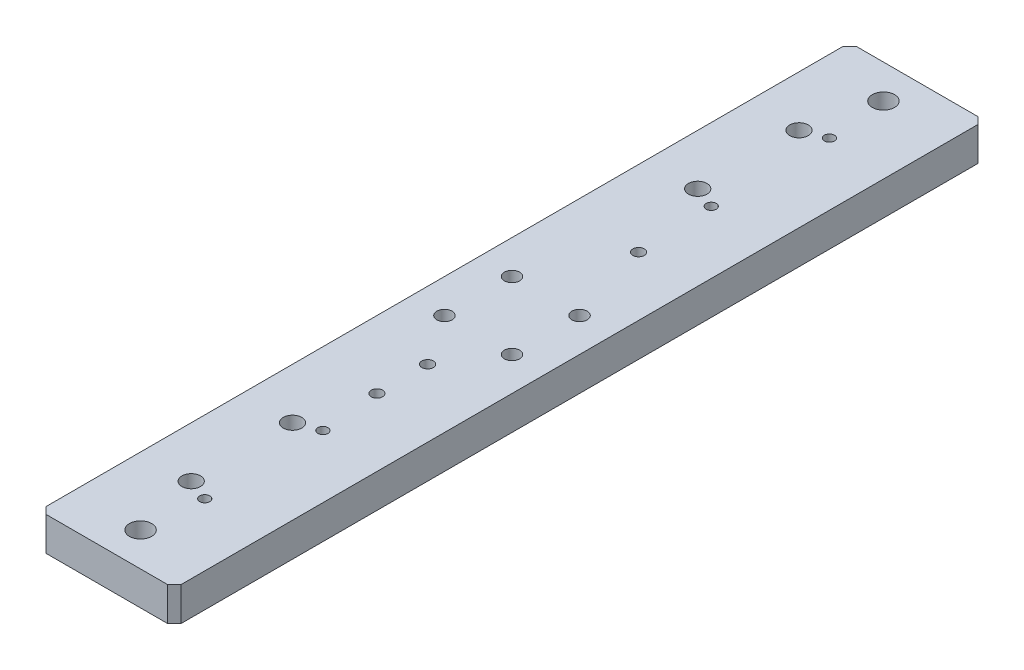
ISO-10303-21;
HEADER;
FILE_DESCRIPTION(('STEP AP214'),'2;1');
FILE_NAME('part.step','',(''),(''),'','','');
FILE_SCHEMA(('AUTOMOTIVE_DESIGN { 1 0 10303 214 1 1 1 1 }'));
ENDSEC;
DATA;
#1=APPLICATION_CONTEXT('core data for automotive mechanical design processes');
#2=APPLICATION_PROTOCOL_DEFINITION('international standard','automotive_design',2000,#1);
#3=PRODUCT_CONTEXT('',#1,'mechanical');
#4=PRODUCT('Part','Part','',(#3));
#5=PRODUCT_RELATED_PRODUCT_CATEGORY('part','',(#4));
#6=PRODUCT_DEFINITION_FORMATION('','',#4);
#7=PRODUCT_DEFINITION_CONTEXT('part definition',#1,'design');
#8=PRODUCT_DEFINITION('design','',#6,#7);
#9=PRODUCT_DEFINITION_SHAPE('','',#8);
#10=(LENGTH_UNIT() NAMED_UNIT(*) SI_UNIT(.MILLI.,.METRE.));
#11=(NAMED_UNIT(*) PLANE_ANGLE_UNIT() SI_UNIT($,.RADIAN.));
#12=(NAMED_UNIT(*) SI_UNIT($,.STERADIAN.) SOLID_ANGLE_UNIT());
#13=UNCERTAINTY_MEASURE_WITH_UNIT(LENGTH_MEASURE(1.E-05),#10,'distance_accuracy_value','');
#14=(GEOMETRIC_REPRESENTATION_CONTEXT(3) GLOBAL_UNCERTAINTY_ASSIGNED_CONTEXT((#13)) GLOBAL_UNIT_ASSIGNED_CONTEXT((#10,
#11,#12)) REPRESENTATION_CONTEXT('',''));
#15=CARTESIAN_POINT('',(0.,0.,0.));
#16=DIRECTION('',(0.,0.,1.));
#17=DIRECTION('',(1.,0.,0.));
#18=AXIS2_PLACEMENT_3D('',#15,#16,#17);
#19=CARTESIAN_POINT('',(0.,10.,120.));
#20=DIRECTION('',(0.,-1.,0.));
#21=DIRECTION('',(0.,0.,-1.));
#22=AXIS2_PLACEMENT_3D('',#19,#20,#21);
#23=PLANE('',#22);
#24=CARTESIAN_POINT('',(22.5,10.,-35.));
#25=DIRECTION('',(0.,-1.,0.));
#26=DIRECTION('',(0.,0.,-1.));
#27=AXIS2_PLACEMENT_3D('',#24,#25,#26);
#28=CIRCLE('',#27,1.7);
#29=CARTESIAN_POINT('',(22.5,10.,-36.7));
#30=VERTEX_POINT('',#29);
#31=EDGE_CURVE('E124',#30,#30,#28,.T.);
#32=ORIENTED_EDGE('',*,*,#31,.T.);
#33=EDGE_LOOP('',(#32));
#34=FACE_BOUND('',#33,.T.);
#35=CARTESIAN_POINT('',(30.,10.,-10.));
#36=DIRECTION('',(0.,1.,0.));
#37=DIRECTION('',(0.,0.,1.));
#38=AXIS2_PLACEMENT_3D('',#35,#36,#37);
#39=CIRCLE('',#38,2.25);
#40=CARTESIAN_POINT('',(30.,10.,-7.75));
#41=VERTEX_POINT('',#40);
#42=EDGE_CURVE('E127',#41,#41,#39,.T.);
#43=ORIENTED_EDGE('',*,*,#42,.F.);
#44=EDGE_LOOP('',(#43));
#45=FACE_BOUND('',#44,.T.);
#46=CARTESIAN_POINT('',(10.,10.,-10.));
#47=DIRECTION('',(0.,1.,0.));
#48=DIRECTION('',(0.,0.,1.));
#49=AXIS2_PLACEMENT_3D('',#46,#47,#48);
#50=CIRCLE('',#49,2.25);
#51=CARTESIAN_POINT('',(10.,10.,-7.75));
#52=VERTEX_POINT('',#51);
#53=EDGE_CURVE('E139',#52,#52,#50,.T.);
#54=ORIENTED_EDGE('',*,*,#53,.F.);
#55=EDGE_LOOP('',(#54));
#56=FACE_BOUND('',#55,.T.);
#57=CARTESIAN_POINT('',(30.,10.,10.));
#58=DIRECTION('',(0.,1.,0.));
#59=DIRECTION('',(0.,0.,1.));
#60=AXIS2_PLACEMENT_3D('',#57,#58,#59);
#61=CIRCLE('',#60,2.25);
#62=CARTESIAN_POINT('',(30.,10.,12.25));
#63=VERTEX_POINT('',#62);
#64=EDGE_CURVE('E145',#63,#63,#61,.T.);
#65=ORIENTED_EDGE('',*,*,#64,.F.);
#66=EDGE_LOOP('',(#65));
#67=FACE_BOUND('',#66,.T.);
#68=CARTESIAN_POINT('',(20.,10.,40.));
#69=DIRECTION('',(0.,1.,0.));
#70=DIRECTION('',(0.,0.,1.));
#71=AXIS2_PLACEMENT_3D('',#68,#69,#70);
#72=CIRCLE('',#71,1.7);
#73=CARTESIAN_POINT('',(20.,10.,41.7));
#74=VERTEX_POINT('',#73);
#75=EDGE_CURVE('E151',#74,#74,#72,.T.);
#76=ORIENTED_EDGE('',*,*,#75,.F.);
#77=EDGE_LOOP('',(#76));
#78=FACE_BOUND('',#77,.T.);
#79=CARTESIAN_POINT('',(20.,10.,25.));
#80=DIRECTION('',(0.,1.,0.));
#81=DIRECTION('',(0.,0.,1.));
#82=AXIS2_PLACEMENT_3D('',#79,#80,#81);
#83=CIRCLE('',#82,1.7);
#84=CARTESIAN_POINT('',(20.,10.,26.7));
#85=VERTEX_POINT('',#84);
#86=EDGE_CURVE('E157',#85,#85,#83,.T.);
#87=ORIENTED_EDGE('',*,*,#86,.F.);
#88=EDGE_LOOP('',(#87));
#89=FACE_BOUND('',#88,.T.);
#90=CARTESIAN_POINT('',(21.5,10.,92.5));
#91=DIRECTION('',(0.,1.,0.));
#92=DIRECTION('',(0.,0.,1.));
#93=AXIS2_PLACEMENT_3D('',#90,#91,#92);
#94=CIRCLE('',#93,1.5);
#95=CARTESIAN_POINT('',(21.5,10.,94.));
#96=VERTEX_POINT('',#95);
#97=EDGE_CURVE('E163',#96,#96,#94,.T.);
#98=ORIENTED_EDGE('',*,*,#97,.F.);
#99=EDGE_LOOP('',(#98));
#100=FACE_BOUND('',#99,.T.);
#101=CARTESIAN_POINT('',(21.5,10.,57.5));
#102=DIRECTION('',(0.,1.,0.));
#103=DIRECTION('',(0.,0.,1.));
#104=AXIS2_PLACEMENT_3D('',#101,#102,#103);
#105=CIRCLE('',#104,1.49999999999999);
#106=CARTESIAN_POINT('',(21.5,10.,59.));
#107=VERTEX_POINT('',#106);
#108=EDGE_CURVE('E169',#107,#107,#105,.T.);
#109=ORIENTED_EDGE('',*,*,#108,.F.);
#110=EDGE_LOOP('',(#109));
#111=FACE_BOUND('',#110,.T.);
#112=CARTESIAN_POINT('',(20.,10.,110.));
#113=DIRECTION('',(0.,-1.,0.));
#114=DIRECTION('',(0.,0.,-1.));
#115=AXIS2_PLACEMENT_3D('',#112,#113,#114);
#116=CIRCLE('',#115,3.3);
#117=CARTESIAN_POINT('',(20.,10.,106.7));
#118=VERTEX_POINT('',#117);
#119=EDGE_CURVE('E178',#118,#118,#116,.T.);
#120=ORIENTED_EDGE('',*,*,#119,.T.);
#121=EDGE_LOOP('',(#120));
#122=FACE_BOUND('',#121,.T.);
#123=CARTESIAN_POINT('',(15.,10.,60.));
#124=DIRECTION('',(0.,1.,0.));
#125=DIRECTION('',(0.,0.,1.));
#126=AXIS2_PLACEMENT_3D('',#123,#124,#125);
#127=CIRCLE('',#126,2.75);
#128=CARTESIAN_POINT('',(15.,10.,62.75));
#129=VERTEX_POINT('',#128);
#130=EDGE_CURVE('E187',#129,#129,#127,.T.);
#131=ORIENTED_EDGE('',*,*,#130,.F.);
#132=EDGE_LOOP('',(#131));
#133=FACE_BOUND('',#132,.T.);
#134=CARTESIAN_POINT('',(21.5,10.,-92.5));
#135=DIRECTION('',(0.,1.,0.));
#136=DIRECTION('',(0.,0.,1.));
#137=AXIS2_PLACEMENT_3D('',#134,#135,#136);
#138=CIRCLE('',#137,1.5);
#139=CARTESIAN_POINT('',(21.5,10.,-91.));
#140=VERTEX_POINT('',#139);
#141=EDGE_CURVE('E193',#140,#140,#138,.T.);
#142=ORIENTED_EDGE('',*,*,#141,.F.);
#143=EDGE_LOOP('',(#142));
#144=FACE_BOUND('',#143,.T.);
#145=CARTESIAN_POINT('',(21.5,10.,-57.5));
#146=DIRECTION('',(0.,1.,0.));
#147=DIRECTION('',(0.,0.,1.));
#148=AXIS2_PLACEMENT_3D('',#145,#146,#147);
#149=CIRCLE('',#148,1.49999999999999);
#150=CARTESIAN_POINT('',(21.5,10.,-56.));
#151=VERTEX_POINT('',#150);
#152=EDGE_CURVE('E199',#151,#151,#149,.T.);
#153=ORIENTED_EDGE('',*,*,#152,.F.);
#154=EDGE_LOOP('',(#153));
#155=FACE_BOUND('',#154,.T.);
#156=CARTESIAN_POINT('',(20.,10.,-110.));
#157=DIRECTION('',(0.,-1.,0.));
#158=DIRECTION('',(0.,0.,-1.));
#159=AXIS2_PLACEMENT_3D('',#156,#157,#158);
#160=CIRCLE('',#159,3.3);
#161=CARTESIAN_POINT('',(20.,10.,-113.3));
#162=VERTEX_POINT('',#161);
#163=EDGE_CURVE('E208',#162,#162,#160,.T.);
#164=ORIENTED_EDGE('',*,*,#163,.T.);
#165=EDGE_LOOP('',(#164));
#166=FACE_BOUND('',#165,.T.);
#167=CARTESIAN_POINT('',(15.,10.,-90.));
#168=DIRECTION('',(0.,1.,0.));
#169=DIRECTION('',(0.,0.,1.));
#170=AXIS2_PLACEMENT_3D('',#167,#168,#169);
#171=CIRCLE('',#170,2.75);
#172=CARTESIAN_POINT('',(15.,10.,-87.25));
#173=VERTEX_POINT('',#172);
#174=EDGE_CURVE('E211',#173,#173,#171,.T.);
#175=ORIENTED_EDGE('',*,*,#174,.F.);
#176=EDGE_LOOP('',(#175));
#177=FACE_BOUND('',#176,.T.);
#178=DIRECTION('',(0.,0.,-1.));
#179=VECTOR('',#178,1.);
#180=CARTESIAN_POINT('',(40.,10.,120.));
#181=LINE('',#180,#179);
#182=CARTESIAN_POINT('',(40.,10.,118.));
#183=VERTEX_POINT('',#182);
#184=CARTESIAN_POINT('',(40.,10.,-118.));
#185=VERTEX_POINT('',#184);
#186=EDGE_CURVE('E238',#183,#185,#181,.T.);
#187=ORIENTED_EDGE('',*,*,#186,.T.);
#188=DIRECTION('',(-0.707106781186553,0.,-0.707106781186543));
#189=VECTOR('',#188,1.);
#190=CARTESIAN_POINT('',(40.,10.,-118.));
#191=LINE('',#190,#189);
#192=CARTESIAN_POINT('',(38.,10.,-120.));
#193=VERTEX_POINT('',#192);
#194=EDGE_CURVE('E257',#185,#193,#191,.T.);
#195=ORIENTED_EDGE('',*,*,#194,.T.);
#196=DIRECTION('',(-1.,0.,0.));
#197=VECTOR('',#196,1.);
#198=CARTESIAN_POINT('',(0.,10.,-120.));
#199=LINE('',#198,#197);
#200=CARTESIAN_POINT('',(2.00000000000006,10.,-120.));
#201=VERTEX_POINT('',#200);
#202=EDGE_CURVE('E228',#193,#201,#199,.T.);
#203=ORIENTED_EDGE('',*,*,#202,.T.);
#204=DIRECTION('',(-0.707106781186553,0.,0.707106781186543));
#205=VECTOR('',#204,1.);
#206=CARTESIAN_POINT('',(0.,10.,-118.));
#207=LINE('',#206,#205);
#208=CARTESIAN_POINT('',(0.,10.,-118.));
#209=VERTEX_POINT('',#208);
#210=EDGE_CURVE('E251',#201,#209,#207,.T.);
#211=ORIENTED_EDGE('',*,*,#210,.T.);
#212=DIRECTION('',(0.,0.,-1.));
#213=VECTOR('',#212,1.);
#214=CARTESIAN_POINT('',(0.,10.,120.));
#215=LINE('',#214,#213);
#216=CARTESIAN_POINT('',(0.,10.,118.));
#217=VERTEX_POINT('',#216);
#218=EDGE_CURVE('E231',#217,#209,#215,.T.);
#219=ORIENTED_EDGE('',*,*,#218,.F.);
#220=DIRECTION('',(-0.707106781186543,0.,-0.707106781186553));
#221=VECTOR('',#220,1.);
#222=CARTESIAN_POINT('',(1.99999999999997,10.,120.));
#223=LINE('',#222,#221);
#224=CARTESIAN_POINT('',(1.99999999999997,10.,120.));
#225=VERTEX_POINT('',#224);
#226=EDGE_CURVE('E253',#217,#225,#223,.F.);
#227=ORIENTED_EDGE('',*,*,#226,.T.);
#228=DIRECTION('',(-1.,0.,0.));
#229=VECTOR('',#228,1.);
#230=CARTESIAN_POINT('',(0.,10.,120.));
#231=LINE('',#230,#229);
#232=CARTESIAN_POINT('',(38.,10.,120.));
#233=VERTEX_POINT('',#232);
#234=EDGE_CURVE('E227',#233,#225,#231,.T.);
#235=ORIENTED_EDGE('',*,*,#234,.F.);
#236=DIRECTION('',(-0.707106781186543,0.,0.707106781186553));
#237=VECTOR('',#236,1.);
#238=CARTESIAN_POINT('',(38.,10.,120.));
#239=LINE('',#238,#237);
#240=EDGE_CURVE('E255',#233,#183,#239,.F.);
#241=ORIENTED_EDGE('',*,*,#240,.T.);
#242=EDGE_LOOP('',(#187,#195,#203,#211,#219,#227,#235,#241));
#243=FACE_BOUND('',#242,.T.);
#244=CARTESIAN_POINT('',(15.,10.,-60.));
#245=DIRECTION('',(0.,1.,0.));
#246=DIRECTION('',(0.,0.,1.));
#247=AXIS2_PLACEMENT_3D('',#244,#245,#246);
#248=CIRCLE('',#247,2.75);
#249=CARTESIAN_POINT('',(15.,10.,-57.25));
#250=VERTEX_POINT('',#249);
#251=EDGE_CURVE('E217',#250,#250,#248,.T.);
#252=ORIENTED_EDGE('',*,*,#251,.F.);
#253=EDGE_LOOP('',(#252));
#254=FACE_BOUND('',#253,.T.);
#255=CARTESIAN_POINT('',(15.,10.,90.));
#256=DIRECTION('',(0.,1.,0.));
#257=DIRECTION('',(0.,0.,1.));
#258=AXIS2_PLACEMENT_3D('',#255,#256,#257);
#259=CIRCLE('',#258,2.75);
#260=CARTESIAN_POINT('',(15.,10.,92.75));
#261=VERTEX_POINT('',#260);
#262=EDGE_CURVE('E181',#261,#261,#259,.T.);
#263=ORIENTED_EDGE('',*,*,#262,.F.);
#264=EDGE_LOOP('',(#263));
#265=FACE_BOUND('',#264,.T.);
#266=CARTESIAN_POINT('',(10.,10.,10.));
#267=DIRECTION('',(0.,1.,0.));
#268=DIRECTION('',(0.,0.,1.));
#269=AXIS2_PLACEMENT_3D('',#266,#267,#268);
#270=CIRCLE('',#269,2.25);
#271=CARTESIAN_POINT('',(10.,10.,12.25));
#272=VERTEX_POINT('',#271);
#273=EDGE_CURVE('E133',#272,#272,#270,.T.);
#274=ORIENTED_EDGE('',*,*,#273,.F.);
#275=EDGE_LOOP('',(#274));
#276=FACE_BOUND('',#275,.T.);
#277=ADVANCED_FACE('F17',(#34,#45,#56,#67,#78,#89,#100,#111,#122,#133,#144,#155,#166,#177,#243,
#254,#265,#276),#23,.F.);
#278=CARTESIAN_POINT('',(0.,0.,120.));
#279=DIRECTION('',(1.,0.,0.));
#280=DIRECTION('',(0.,0.,-1.));
#281=AXIS2_PLACEMENT_3D('',#278,#279,#280);
#282=PLANE('',#281);
#283=DIRECTION('',(0.,0.,-1.));
#284=VECTOR('',#283,1.);
#285=CARTESIAN_POINT('',(0.,0.,120.));
#286=LINE('',#285,#284);
#287=CARTESIAN_POINT('',(0.,0.,118.));
#288=VERTEX_POINT('',#287);
#289=CARTESIAN_POINT('',(0.,0.,-118.));
#290=VERTEX_POINT('',#289);
#291=EDGE_CURVE('E244',#288,#290,#286,.T.);
#292=ORIENTED_EDGE('',*,*,#291,.F.);
#293=DIRECTION('',(0.,1.,0.));
#294=VECTOR('',#293,1.);
#295=CARTESIAN_POINT('',(0.,0.,118.));
#296=LINE('',#295,#294);
#297=EDGE_CURVE('E11',#288,#217,#296,.T.);
#298=ORIENTED_EDGE('',*,*,#297,.T.);
#299=ORIENTED_EDGE('',*,*,#218,.T.);
#300=DIRECTION('',(0.,-1.,0.));
#301=VECTOR('',#300,1.);
#302=CARTESIAN_POINT('',(0.,0.,-118.));
#303=LINE('',#302,#301);
#304=EDGE_CURVE('E26',#209,#290,#303,.T.);
#305=ORIENTED_EDGE('',*,*,#304,.T.);
#306=EDGE_LOOP('',(#292,#298,#299,#305));
#307=FACE_BOUND('',#306,.T.);
#308=ADVANCED_FACE('F275',(#307),#282,.F.);
#309=CARTESIAN_POINT('',(0.,0.,120.));
#310=DIRECTION('',(0.,1.,0.));
#311=DIRECTION('',(0.,0.,1.));
#312=AXIS2_PLACEMENT_3D('',#309,#310,#311);
#313=PLANE('',#312);
#314=CARTESIAN_POINT('',(18.5,0.,-28.));
#315=DIRECTION('',(0.,-1.,0.));
#316=DIRECTION('',(0.,0.,-1.));
#317=AXIS2_PLACEMENT_3D('',#314,#315,#316);
#318=CIRCLE('',#317,1.5);
#319=CARTESIAN_POINT('',(18.5,0.,-29.5));
#320=VERTEX_POINT('',#319);
#321=EDGE_CURVE('E111',#320,#320,#318,.T.);
#322=ORIENTED_EDGE('',*,*,#321,.F.);
#323=EDGE_LOOP('',(#322));
#324=FACE_BOUND('',#323,.T.);
#325=CARTESIAN_POINT('',(18.5,0.,-42.));
#326=DIRECTION('',(0.,-1.,0.));
#327=DIRECTION('',(0.,0.,-1.));
#328=AXIS2_PLACEMENT_3D('',#325,#326,#327);
#329=CIRCLE('',#328,1.5);
#330=CARTESIAN_POINT('',(18.5,0.,-43.5));
#331=VERTEX_POINT('',#330);
#332=EDGE_CURVE('E110',#331,#331,#329,.T.);
#333=ORIENTED_EDGE('',*,*,#332,.F.);
#334=EDGE_LOOP('',(#333));
#335=FACE_BOUND('',#334,.T.);
#336=CARTESIAN_POINT('',(22.5,0.,-35.));
#337=DIRECTION('',(0.,-1.,0.));
#338=DIRECTION('',(0.,0.,-1.));
#339=AXIS2_PLACEMENT_3D('',#336,#337,#338);
#340=CIRCLE('',#339,1.7);
#341=CARTESIAN_POINT('',(22.5,0.,-36.7));
#342=VERTEX_POINT('',#341);
#343=EDGE_CURVE('E121',#342,#342,#340,.T.);
#344=ORIENTED_EDGE('',*,*,#343,.F.);
#345=EDGE_LOOP('',(#344));
#346=FACE_BOUND('',#345,.T.);
#347=CARTESIAN_POINT('',(30.,0.,-10.));
#348=DIRECTION('',(0.,1.,0.));
#349=DIRECTION('',(0.,0.,1.));
#350=AXIS2_PLACEMENT_3D('',#347,#348,#349);
#351=CIRCLE('',#350,2.25);
#352=CARTESIAN_POINT('',(30.,0.,-7.75));
#353=VERTEX_POINT('',#352);
#354=EDGE_CURVE('E130',#353,#353,#351,.T.);
#355=ORIENTED_EDGE('',*,*,#354,.T.);
#356=EDGE_LOOP('',(#355));
#357=FACE_BOUND('',#356,.T.);
#358=CARTESIAN_POINT('',(10.,0.,10.));
#359=DIRECTION('',(0.,1.,0.));
#360=DIRECTION('',(0.,0.,1.));
#361=AXIS2_PLACEMENT_3D('',#358,#359,#360);
#362=CIRCLE('',#361,2.25);
#363=CARTESIAN_POINT('',(10.,0.,12.25));
#364=VERTEX_POINT('',#363);
#365=EDGE_CURVE('E136',#364,#364,#362,.T.);
#366=ORIENTED_EDGE('',*,*,#365,.T.);
#367=EDGE_LOOP('',(#366));
#368=FACE_BOUND('',#367,.T.);
#369=CARTESIAN_POINT('',(10.,0.,-10.));
#370=DIRECTION('',(0.,1.,0.));
#371=DIRECTION('',(0.,0.,1.));
#372=AXIS2_PLACEMENT_3D('',#369,#370,#371);
#373=CIRCLE('',#372,2.25);
#374=CARTESIAN_POINT('',(10.,0.,-7.75));
#375=VERTEX_POINT('',#374);
#376=EDGE_CURVE('E142',#375,#375,#373,.T.);
#377=ORIENTED_EDGE('',*,*,#376,.T.);
#378=EDGE_LOOP('',(#377));
#379=FACE_BOUND('',#378,.T.);
#380=CARTESIAN_POINT('',(30.,0.,10.));
#381=DIRECTION('',(0.,1.,0.));
#382=DIRECTION('',(0.,0.,1.));
#383=AXIS2_PLACEMENT_3D('',#380,#381,#382);
#384=CIRCLE('',#383,2.25);
#385=CARTESIAN_POINT('',(30.,0.,12.25));
#386=VERTEX_POINT('',#385);
#387=EDGE_CURVE('E148',#386,#386,#384,.T.);
#388=ORIENTED_EDGE('',*,*,#387,.T.);
#389=EDGE_LOOP('',(#388));
#390=FACE_BOUND('',#389,.T.);
#391=CARTESIAN_POINT('',(20.,0.,40.));
#392=DIRECTION('',(0.,1.,0.));
#393=DIRECTION('',(0.,0.,1.));
#394=AXIS2_PLACEMENT_3D('',#391,#392,#393);
#395=CIRCLE('',#394,1.7);
#396=CARTESIAN_POINT('',(20.,0.,41.7));
#397=VERTEX_POINT('',#396);
#398=EDGE_CURVE('E154',#397,#397,#395,.T.);
#399=ORIENTED_EDGE('',*,*,#398,.T.);
#400=EDGE_LOOP('',(#399));
#401=FACE_BOUND('',#400,.T.);
#402=CARTESIAN_POINT('',(20.,0.,25.));
#403=DIRECTION('',(0.,1.,0.));
#404=DIRECTION('',(0.,0.,1.));
#405=AXIS2_PLACEMENT_3D('',#402,#403,#404);
#406=CIRCLE('',#405,1.7);
#407=CARTESIAN_POINT('',(20.,0.,26.7));
#408=VERTEX_POINT('',#407);
#409=EDGE_CURVE('E160',#408,#408,#406,.T.);
#410=ORIENTED_EDGE('',*,*,#409,.T.);
#411=EDGE_LOOP('',(#410));
#412=FACE_BOUND('',#411,.T.);
#413=CARTESIAN_POINT('',(20.,0.,110.));
#414=DIRECTION('',(0.,-1.,0.));
#415=DIRECTION('',(0.,0.,-1.));
#416=AXIS2_PLACEMENT_3D('',#413,#414,#415);
#417=CIRCLE('',#416,3.3);
#418=CARTESIAN_POINT('',(20.,0.,106.7));
#419=VERTEX_POINT('',#418);
#420=EDGE_CURVE('E175',#419,#419,#417,.T.);
#421=ORIENTED_EDGE('',*,*,#420,.F.);
#422=EDGE_LOOP('',(#421));
#423=FACE_BOUND('',#422,.T.);
#424=CARTESIAN_POINT('',(15.,0.,90.));
#425=DIRECTION('',(0.,1.,0.));
#426=DIRECTION('',(0.,0.,1.));
#427=AXIS2_PLACEMENT_3D('',#424,#425,#426);
#428=CIRCLE('',#427,2.75);
#429=CARTESIAN_POINT('',(15.,0.,92.75));
#430=VERTEX_POINT('',#429);
#431=EDGE_CURVE('E184',#430,#430,#428,.T.);
#432=ORIENTED_EDGE('',*,*,#431,.T.);
#433=EDGE_LOOP('',(#432));
#434=FACE_BOUND('',#433,.T.);
#435=CARTESIAN_POINT('',(15.,0.,60.));
#436=DIRECTION('',(0.,1.,0.));
#437=DIRECTION('',(0.,0.,1.));
#438=AXIS2_PLACEMENT_3D('',#435,#436,#437);
#439=CIRCLE('',#438,2.75);
#440=CARTESIAN_POINT('',(15.,0.,62.75));
#441=VERTEX_POINT('',#440);
#442=EDGE_CURVE('E190',#441,#441,#439,.T.);
#443=ORIENTED_EDGE('',*,*,#442,.T.);
#444=EDGE_LOOP('',(#443));
#445=FACE_BOUND('',#444,.T.);
#446=CARTESIAN_POINT('',(20.,0.,-110.));
#447=DIRECTION('',(0.,-1.,0.));
#448=DIRECTION('',(0.,0.,-1.));
#449=AXIS2_PLACEMENT_3D('',#446,#447,#448);
#450=CIRCLE('',#449,3.3);
#451=CARTESIAN_POINT('',(20.,0.,-113.3));
#452=VERTEX_POINT('',#451);
#453=EDGE_CURVE('E205',#452,#452,#450,.T.);
#454=ORIENTED_EDGE('',*,*,#453,.F.);
#455=EDGE_LOOP('',(#454));
#456=FACE_BOUND('',#455,.T.);
#457=CARTESIAN_POINT('',(15.,0.,-90.));
#458=DIRECTION('',(0.,1.,0.));
#459=DIRECTION('',(0.,0.,1.));
#460=AXIS2_PLACEMENT_3D('',#457,#458,#459);
#461=CIRCLE('',#460,2.75);
#462=CARTESIAN_POINT('',(15.,0.,-87.25));
#463=VERTEX_POINT('',#462);
#464=EDGE_CURVE('E214',#463,#463,#461,.T.);
#465=ORIENTED_EDGE('',*,*,#464,.T.);
#466=EDGE_LOOP('',(#465));
#467=FACE_BOUND('',#466,.T.);
#468=CARTESIAN_POINT('',(15.,0.,-60.));
#469=DIRECTION('',(0.,1.,0.));
#470=DIRECTION('',(0.,0.,1.));
#471=AXIS2_PLACEMENT_3D('',#468,#469,#470);
#472=CIRCLE('',#471,2.75);
#473=CARTESIAN_POINT('',(15.,0.,-57.25));
#474=VERTEX_POINT('',#473);
#475=EDGE_CURVE('E220',#474,#474,#472,.T.);
#476=ORIENTED_EDGE('',*,*,#475,.T.);
#477=EDGE_LOOP('',(#476));
#478=FACE_BOUND('',#477,.T.);
#479=DIRECTION('',(1.,0.,0.));
#480=VECTOR('',#479,1.);
#481=CARTESIAN_POINT('',(0.,0.,-120.));
#482=LINE('',#481,#480);
#483=CARTESIAN_POINT('',(2.00000000000006,0.,-120.));
#484=VERTEX_POINT('',#483);
#485=CARTESIAN_POINT('',(38.,0.,-120.));
#486=VERTEX_POINT('',#485);
#487=EDGE_CURVE('E223',#484,#486,#482,.T.);
#488=ORIENTED_EDGE('',*,*,#487,.T.);
#489=DIRECTION('',(0.707106781186553,0.,0.707106781186543));
#490=VECTOR('',#489,1.);
#491=CARTESIAN_POINT('',(40.,0.,-118.));
#492=LINE('',#491,#490);
#493=CARTESIAN_POINT('',(40.,0.,-118.));
#494=VERTEX_POINT('',#493);
#495=EDGE_CURVE('E267',#486,#494,#492,.T.);
#496=ORIENTED_EDGE('',*,*,#495,.T.);
#497=DIRECTION('',(0.,0.,-1.));
#498=VECTOR('',#497,1.);
#499=CARTESIAN_POINT('',(40.,0.,120.));
#500=LINE('',#499,#498);
#501=CARTESIAN_POINT('',(40.,0.,118.));
#502=VERTEX_POINT('',#501);
#503=EDGE_CURVE('E241',#502,#494,#500,.T.);
#504=ORIENTED_EDGE('',*,*,#503,.F.);
#505=DIRECTION('',(0.707106781186543,0.,-0.707106781186553));
#506=VECTOR('',#505,1.);
#507=CARTESIAN_POINT('',(38.,0.,120.));
#508=LINE('',#507,#506);
#509=CARTESIAN_POINT('',(38.,0.,120.));
#510=VERTEX_POINT('',#509);
#511=EDGE_CURVE('E265',#502,#510,#508,.F.);
#512=ORIENTED_EDGE('',*,*,#511,.T.);
#513=DIRECTION('',(1.,0.,0.));
#514=VECTOR('',#513,1.);
#515=CARTESIAN_POINT('',(0.,0.,120.));
#516=LINE('',#515,#514);
#517=CARTESIAN_POINT('',(1.99999999999997,0.,120.));
#518=VERTEX_POINT('',#517);
#519=EDGE_CURVE('E224',#518,#510,#516,.T.);
#520=ORIENTED_EDGE('',*,*,#519,.F.);
#521=DIRECTION('',(0.707106781186543,0.,0.707106781186553));
#522=VECTOR('',#521,1.);
#523=CARTESIAN_POINT('',(1.99999999999997,0.,120.));
#524=LINE('',#523,#522);
#525=EDGE_CURVE('E41',#518,#288,#524,.F.);
#526=ORIENTED_EDGE('',*,*,#525,.T.);
#527=ORIENTED_EDGE('',*,*,#291,.T.);
#528=DIRECTION('',(0.707106781186553,0.,-0.707106781186543));
#529=VECTOR('',#528,1.);
#530=CARTESIAN_POINT('',(0.,0.,-118.));
#531=LINE('',#530,#529);
#532=EDGE_CURVE('E33',#290,#484,#531,.T.);
#533=ORIENTED_EDGE('',*,*,#532,.T.);
#534=EDGE_LOOP('',(#488,#496,#504,#512,#520,#526,#527,#533));
#535=FACE_BOUND('',#534,.T.);
#536=ADVANCED_FACE('F279',(#324,#335,#346,#357,#368,#379,#390,#401,#412,#423,#434,#445,#456,
#467,#478,#535),#313,.F.);
#537=CARTESIAN_POINT('',(40.,0.,120.));
#538=DIRECTION('',(-1.,0.,0.));
#539=DIRECTION('',(0.,-1.,0.));
#540=AXIS2_PLACEMENT_3D('',#537,#538,#539);
#541=PLANE('',#540);
#542=ORIENTED_EDGE('',*,*,#503,.T.);
#543=DIRECTION('',(0.,1.,0.));
#544=VECTOR('',#543,1.);
#545=CARTESIAN_POINT('',(40.,10.,-118.));
#546=LINE('',#545,#544);
#547=EDGE_CURVE('E248',#494,#185,#546,.T.);
#548=ORIENTED_EDGE('',*,*,#547,.T.);
#549=ORIENTED_EDGE('',*,*,#186,.F.);
#550=DIRECTION('',(0.,-1.,0.));
#551=VECTOR('',#550,1.);
#552=CARTESIAN_POINT('',(40.,0.,118.));
#553=LINE('',#552,#551);
#554=EDGE_CURVE('E246',#183,#502,#553,.T.);
#555=ORIENTED_EDGE('',*,*,#554,.T.);
#556=EDGE_LOOP('',(#542,#548,#549,#555));
#557=FACE_BOUND('',#556,.T.);
#558=ADVANCED_FACE('F295',(#557),#541,.F.);
#559=CARTESIAN_POINT('',(0.,0.,120.));
#560=DIRECTION('',(0.,0.,-1.));
#561=DIRECTION('',(-1.,0.,0.));
#562=AXIS2_PLACEMENT_3D('',#559,#560,#561);
#563=PLANE('',#562);
#564=ORIENTED_EDGE('',*,*,#519,.T.);
#565=DIRECTION('',(0.,1.,0.));
#566=VECTOR('',#565,1.);
#567=CARTESIAN_POINT('',(38.,0.,120.));
#568=LINE('',#567,#566);
#569=EDGE_CURVE('E272',#510,#233,#568,.T.);
#570=ORIENTED_EDGE('',*,*,#569,.T.);
#571=ORIENTED_EDGE('',*,*,#234,.T.);
#572=DIRECTION('',(0.,-1.,0.));
#573=VECTOR('',#572,1.);
#574=CARTESIAN_POINT('',(1.99999999999997,0.,120.));
#575=LINE('',#574,#573);
#576=EDGE_CURVE('E269',#225,#518,#575,.T.);
#577=ORIENTED_EDGE('',*,*,#576,.T.);
#578=EDGE_LOOP('',(#564,#570,#571,#577));
#579=FACE_BOUND('',#578,.T.);
#580=ADVANCED_FACE('F302',(#579),#563,.F.);
#581=CARTESIAN_POINT('',(0.,0.,-120.));
#582=DIRECTION('',(0.,0.,-1.));
#583=DIRECTION('',(-1.,0.,0.));
#584=AXIS2_PLACEMENT_3D('',#581,#582,#583);
#585=PLANE('',#584);
#586=ORIENTED_EDGE('',*,*,#202,.F.);
#587=DIRECTION('',(0.,-1.,0.));
#588=VECTOR('',#587,1.);
#589=CARTESIAN_POINT('',(38.,0.,-120.));
#590=LINE('',#589,#588);
#591=EDGE_CURVE('E261',#193,#486,#590,.T.);
#592=ORIENTED_EDGE('',*,*,#591,.T.);
#593=ORIENTED_EDGE('',*,*,#487,.F.);
#594=DIRECTION('',(0.,1.,0.));
#595=VECTOR('',#594,1.);
#596=CARTESIAN_POINT('',(2.00000000000006,10.,-120.));
#597=LINE('',#596,#595);
#598=EDGE_CURVE('E259',#484,#201,#597,.T.);
#599=ORIENTED_EDGE('',*,*,#598,.T.);
#600=EDGE_LOOP('',(#586,#592,#593,#599));
#601=FACE_BOUND('',#600,.T.);
#602=ADVANCED_FACE('F284',(#601),#585,.T.);
#603=CARTESIAN_POINT('',(15.,10.,-60.));
#604=DIRECTION('',(0.,1.,0.));
#605=DIRECTION('',(0.,0.,1.));
#606=AXIS2_PLACEMENT_3D('',#603,#604,#605);
#607=CYLINDRICAL_SURFACE('',#606,2.75);
#608=ORIENTED_EDGE('',*,*,#475,.F.);
#609=EDGE_LOOP('',(#608));
#610=FACE_BOUND('',#609,.T.);
#611=ORIENTED_EDGE('',*,*,#251,.T.);
#612=EDGE_LOOP('',(#611));
#613=FACE_BOUND('',#612,.T.);
#614=ADVANCED_FACE('F434',(#610,#613),#607,.F.);
#615=CARTESIAN_POINT('',(15.,10.,-90.));
#616=DIRECTION('',(0.,1.,0.));
#617=DIRECTION('',(0.,0.,1.));
#618=AXIS2_PLACEMENT_3D('',#615,#616,#617);
#619=CYLINDRICAL_SURFACE('',#618,2.75);
#620=ORIENTED_EDGE('',*,*,#464,.F.);
#621=EDGE_LOOP('',(#620));
#622=FACE_BOUND('',#621,.T.);
#623=ORIENTED_EDGE('',*,*,#174,.T.);
#624=EDGE_LOOP('',(#623));
#625=FACE_BOUND('',#624,.T.);
#626=ADVANCED_FACE('F430',(#622,#625),#619,.F.);
#627=CARTESIAN_POINT('',(20.,0.,-110.));
#628=DIRECTION('',(0.,-1.,0.));
#629=DIRECTION('',(0.,0.,-1.));
#630=AXIS2_PLACEMENT_3D('',#627,#628,#629);
#631=CYLINDRICAL_SURFACE('',#630,3.3);
#632=ORIENTED_EDGE('',*,*,#163,.F.);
#633=EDGE_LOOP('',(#632));
#634=FACE_BOUND('',#633,.T.);
#635=ORIENTED_EDGE('',*,*,#453,.T.);
#636=EDGE_LOOP('',(#635));
#637=FACE_BOUND('',#636,.T.);
#638=ADVANCED_FACE('F426',(#634,#637),#631,.F.);
#639=CARTESIAN_POINT('',(21.5,4.8,-57.5));
#640=DIRECTION('',(0.,1.,0.));
#641=DIRECTION('',(0.,0.,1.));
#642=AXIS2_PLACEMENT_3D('',#639,#640,#641);
#643=CONICAL_SURFACE('',#642,1.5,1.02974425867665);
#644=CARTESIAN_POINT('',(21.5,3.89870907145866,-57.5));
#645=VERTEX_POINT('',#644);
#646=VERTEX_LOOP('',#645);
#647=FACE_BOUND('',#646,.T.);
#648=CARTESIAN_POINT('',(21.5,4.8,-57.5));
#649=DIRECTION('',(0.,1.,0.));
#650=DIRECTION('',(0.,0.,1.));
#651=AXIS2_PLACEMENT_3D('',#648,#649,#650);
#652=CIRCLE('',#651,1.5);
#653=CARTESIAN_POINT('',(21.5,4.8,-56.));
#654=VERTEX_POINT('',#653);
#655=EDGE_CURVE('E202',#654,#654,#652,.T.);
#656=ORIENTED_EDGE('',*,*,#655,.T.);
#657=EDGE_LOOP('',(#656));
#658=FACE_BOUND('',#657,.T.);
#659=ADVANCED_FACE('F422',(#647,#658),#643,.F.);
#660=CARTESIAN_POINT('',(21.5,10.,-57.5));
#661=DIRECTION('',(0.,1.,0.));
#662=DIRECTION('',(0.,0.,1.));
#663=AXIS2_PLACEMENT_3D('',#660,#661,#662);
#664=CYLINDRICAL_SURFACE('',#663,1.5);
#665=ORIENTED_EDGE('',*,*,#655,.F.);
#666=EDGE_LOOP('',(#665));
#667=FACE_BOUND('',#666,.T.);
#668=ORIENTED_EDGE('',*,*,#152,.T.);
#669=EDGE_LOOP('',(#668));
#670=FACE_BOUND('',#669,.T.);
#671=ADVANCED_FACE('F418',(#667,#670),#664,.F.);
#672=CARTESIAN_POINT('',(21.5,4.8,-92.5));
#673=DIRECTION('',(0.,1.,0.));
#674=DIRECTION('',(0.,0.,1.));
#675=AXIS2_PLACEMENT_3D('',#672,#673,#674);
#676=CONICAL_SURFACE('',#675,1.5,1.02974425867665);
#677=CARTESIAN_POINT('',(21.5,3.89870907145866,-92.5));
#678=VERTEX_POINT('',#677);
#679=VERTEX_LOOP('',#678);
#680=FACE_BOUND('',#679,.T.);
#681=CARTESIAN_POINT('',(21.5,4.8,-92.5));
#682=DIRECTION('',(0.,1.,0.));
#683=DIRECTION('',(0.,0.,1.));
#684=AXIS2_PLACEMENT_3D('',#681,#682,#683);
#685=CIRCLE('',#684,1.5);
#686=CARTESIAN_POINT('',(21.5,4.8,-91.));
#687=VERTEX_POINT('',#686);
#688=EDGE_CURVE('E196',#687,#687,#685,.T.);
#689=ORIENTED_EDGE('',*,*,#688,.T.);
#690=EDGE_LOOP('',(#689));
#691=FACE_BOUND('',#690,.T.);
#692=ADVANCED_FACE('F414',(#680,#691),#676,.F.);
#693=CARTESIAN_POINT('',(21.5,10.,-92.5));
#694=DIRECTION('',(0.,1.,0.));
#695=DIRECTION('',(0.,0.,1.));
#696=AXIS2_PLACEMENT_3D('',#693,#694,#695);
#697=CYLINDRICAL_SURFACE('',#696,1.5);
#698=ORIENTED_EDGE('',*,*,#688,.F.);
#699=EDGE_LOOP('',(#698));
#700=FACE_BOUND('',#699,.T.);
#701=ORIENTED_EDGE('',*,*,#141,.T.);
#702=EDGE_LOOP('',(#701));
#703=FACE_BOUND('',#702,.T.);
#704=ADVANCED_FACE('F410',(#700,#703),#697,.F.);
#705=CARTESIAN_POINT('',(15.,10.,60.));
#706=DIRECTION('',(0.,1.,0.));
#707=DIRECTION('',(0.,0.,1.));
#708=AXIS2_PLACEMENT_3D('',#705,#706,#707);
#709=CYLINDRICAL_SURFACE('',#708,2.75);
#710=ORIENTED_EDGE('',*,*,#442,.F.);
#711=EDGE_LOOP('',(#710));
#712=FACE_BOUND('',#711,.T.);
#713=ORIENTED_EDGE('',*,*,#130,.T.);
#714=EDGE_LOOP('',(#713));
#715=FACE_BOUND('',#714,.T.);
#716=ADVANCED_FACE('F406',(#712,#715),#709,.F.);
#717=CARTESIAN_POINT('',(15.,10.,90.));
#718=DIRECTION('',(0.,1.,0.));
#719=DIRECTION('',(0.,0.,1.));
#720=AXIS2_PLACEMENT_3D('',#717,#718,#719);
#721=CYLINDRICAL_SURFACE('',#720,2.75);
#722=ORIENTED_EDGE('',*,*,#431,.F.);
#723=EDGE_LOOP('',(#722));
#724=FACE_BOUND('',#723,.T.);
#725=ORIENTED_EDGE('',*,*,#262,.T.);
#726=EDGE_LOOP('',(#725));
#727=FACE_BOUND('',#726,.T.);
#728=ADVANCED_FACE('F402',(#724,#727),#721,.F.);
#729=CARTESIAN_POINT('',(20.,0.,110.));
#730=DIRECTION('',(0.,-1.,0.));
#731=DIRECTION('',(0.,0.,-1.));
#732=AXIS2_PLACEMENT_3D('',#729,#730,#731);
#733=CYLINDRICAL_SURFACE('',#732,3.3);
#734=ORIENTED_EDGE('',*,*,#119,.F.);
#735=EDGE_LOOP('',(#734));
#736=FACE_BOUND('',#735,.T.);
#737=ORIENTED_EDGE('',*,*,#420,.T.);
#738=EDGE_LOOP('',(#737));
#739=FACE_BOUND('',#738,.T.);
#740=ADVANCED_FACE('F398',(#736,#739),#733,.F.);
#741=CARTESIAN_POINT('',(21.5,4.8,57.5));
#742=DIRECTION('',(0.,1.,0.));
#743=DIRECTION('',(0.,0.,1.));
#744=AXIS2_PLACEMENT_3D('',#741,#742,#743);
#745=CONICAL_SURFACE('',#744,1.5,1.02974425867665);
#746=CARTESIAN_POINT('',(21.5,3.89870907145866,57.5));
#747=VERTEX_POINT('',#746);
#748=VERTEX_LOOP('',#747);
#749=FACE_BOUND('',#748,.T.);
#750=CARTESIAN_POINT('',(21.5,4.8,57.5));
#751=DIRECTION('',(0.,1.,0.));
#752=DIRECTION('',(0.,0.,1.));
#753=AXIS2_PLACEMENT_3D('',#750,#751,#752);
#754=CIRCLE('',#753,1.5);
#755=CARTESIAN_POINT('',(21.5,4.8,59.));
#756=VERTEX_POINT('',#755);
#757=EDGE_CURVE('E172',#756,#756,#754,.T.);
#758=ORIENTED_EDGE('',*,*,#757,.T.);
#759=EDGE_LOOP('',(#758));
#760=FACE_BOUND('',#759,.T.);
#761=ADVANCED_FACE('F394',(#749,#760),#745,.F.);
#762=CARTESIAN_POINT('',(21.5,10.,57.5));
#763=DIRECTION('',(0.,1.,0.));
#764=DIRECTION('',(0.,0.,1.));
#765=AXIS2_PLACEMENT_3D('',#762,#763,#764);
#766=CYLINDRICAL_SURFACE('',#765,1.5);
#767=ORIENTED_EDGE('',*,*,#757,.F.);
#768=EDGE_LOOP('',(#767));
#769=FACE_BOUND('',#768,.T.);
#770=ORIENTED_EDGE('',*,*,#108,.T.);
#771=EDGE_LOOP('',(#770));
#772=FACE_BOUND('',#771,.T.);
#773=ADVANCED_FACE('F390',(#769,#772),#766,.F.);
#774=CARTESIAN_POINT('',(21.5,4.8,92.5));
#775=DIRECTION('',(0.,1.,0.));
#776=DIRECTION('',(0.,0.,1.));
#777=AXIS2_PLACEMENT_3D('',#774,#775,#776);
#778=CONICAL_SURFACE('',#777,1.5,1.02974425867665);
#779=CARTESIAN_POINT('',(21.5,3.89870907145866,92.5));
#780=VERTEX_POINT('',#779);
#781=VERTEX_LOOP('',#780);
#782=FACE_BOUND('',#781,.T.);
#783=CARTESIAN_POINT('',(21.5,4.8,92.5));
#784=DIRECTION('',(0.,1.,0.));
#785=DIRECTION('',(0.,0.,1.));
#786=AXIS2_PLACEMENT_3D('',#783,#784,#785);
#787=CIRCLE('',#786,1.5);
#788=CARTESIAN_POINT('',(21.5,4.8,94.));
#789=VERTEX_POINT('',#788);
#790=EDGE_CURVE('E166',#789,#789,#787,.T.);
#791=ORIENTED_EDGE('',*,*,#790,.T.);
#792=EDGE_LOOP('',(#791));
#793=FACE_BOUND('',#792,.T.);
#794=ADVANCED_FACE('F386',(#782,#793),#778,.F.);
#795=CARTESIAN_POINT('',(21.5,10.,92.5));
#796=DIRECTION('',(0.,1.,0.));
#797=DIRECTION('',(0.,0.,1.));
#798=AXIS2_PLACEMENT_3D('',#795,#796,#797);
#799=CYLINDRICAL_SURFACE('',#798,1.5);
#800=ORIENTED_EDGE('',*,*,#790,.F.);
#801=EDGE_LOOP('',(#800));
#802=FACE_BOUND('',#801,.T.);
#803=ORIENTED_EDGE('',*,*,#97,.T.);
#804=EDGE_LOOP('',(#803));
#805=FACE_BOUND('',#804,.T.);
#806=ADVANCED_FACE('F382',(#802,#805),#799,.F.);
#807=CARTESIAN_POINT('',(20.,10.,25.));
#808=DIRECTION('',(0.,1.,0.));
#809=DIRECTION('',(0.,0.,1.));
#810=AXIS2_PLACEMENT_3D('',#807,#808,#809);
#811=CYLINDRICAL_SURFACE('',#810,1.7);
#812=ORIENTED_EDGE('',*,*,#409,.F.);
#813=EDGE_LOOP('',(#812));
#814=FACE_BOUND('',#813,.T.);
#815=ORIENTED_EDGE('',*,*,#86,.T.);
#816=EDGE_LOOP('',(#815));
#817=FACE_BOUND('',#816,.T.);
#818=ADVANCED_FACE('F378',(#814,#817),#811,.F.);
#819=CARTESIAN_POINT('',(20.,10.,40.));
#820=DIRECTION('',(0.,1.,0.));
#821=DIRECTION('',(0.,0.,1.));
#822=AXIS2_PLACEMENT_3D('',#819,#820,#821);
#823=CYLINDRICAL_SURFACE('',#822,1.7);
#824=ORIENTED_EDGE('',*,*,#398,.F.);
#825=EDGE_LOOP('',(#824));
#826=FACE_BOUND('',#825,.T.);
#827=ORIENTED_EDGE('',*,*,#75,.T.);
#828=EDGE_LOOP('',(#827));
#829=FACE_BOUND('',#828,.T.);
#830=ADVANCED_FACE('F374',(#826,#829),#823,.F.);
#831=CARTESIAN_POINT('',(30.,10.,10.));
#832=DIRECTION('',(0.,1.,0.));
#833=DIRECTION('',(0.,0.,1.));
#834=AXIS2_PLACEMENT_3D('',#831,#832,#833);
#835=CYLINDRICAL_SURFACE('',#834,2.25);
#836=ORIENTED_EDGE('',*,*,#387,.F.);
#837=EDGE_LOOP('',(#836));
#838=FACE_BOUND('',#837,.T.);
#839=ORIENTED_EDGE('',*,*,#64,.T.);
#840=EDGE_LOOP('',(#839));
#841=FACE_BOUND('',#840,.T.);
#842=ADVANCED_FACE('F370',(#838,#841),#835,.F.);
#843=CARTESIAN_POINT('',(10.,10.,-10.));
#844=DIRECTION('',(0.,1.,0.));
#845=DIRECTION('',(0.,0.,1.));
#846=AXIS2_PLACEMENT_3D('',#843,#844,#845);
#847=CYLINDRICAL_SURFACE('',#846,2.25);
#848=ORIENTED_EDGE('',*,*,#376,.F.);
#849=EDGE_LOOP('',(#848));
#850=FACE_BOUND('',#849,.T.);
#851=ORIENTED_EDGE('',*,*,#53,.T.);
#852=EDGE_LOOP('',(#851));
#853=FACE_BOUND('',#852,.T.);
#854=ADVANCED_FACE('F360',(#850,#853),#847,.F.);
#855=CARTESIAN_POINT('',(10.,10.,10.));
#856=DIRECTION('',(0.,1.,0.));
#857=DIRECTION('',(0.,0.,1.));
#858=AXIS2_PLACEMENT_3D('',#855,#856,#857);
#859=CYLINDRICAL_SURFACE('',#858,2.25);
#860=ORIENTED_EDGE('',*,*,#365,.F.);
#861=EDGE_LOOP('',(#860));
#862=FACE_BOUND('',#861,.T.);
#863=ORIENTED_EDGE('',*,*,#273,.T.);
#864=EDGE_LOOP('',(#863));
#865=FACE_BOUND('',#864,.T.);
#866=ADVANCED_FACE('F353',(#862,#865),#859,.F.);
#867=CARTESIAN_POINT('',(30.,10.,-10.));
#868=DIRECTION('',(0.,1.,0.));
#869=DIRECTION('',(0.,0.,1.));
#870=AXIS2_PLACEMENT_3D('',#867,#868,#869);
#871=CYLINDRICAL_SURFACE('',#870,2.25);
#872=ORIENTED_EDGE('',*,*,#354,.F.);
#873=EDGE_LOOP('',(#872));
#874=FACE_BOUND('',#873,.T.);
#875=ORIENTED_EDGE('',*,*,#42,.T.);
#876=EDGE_LOOP('',(#875));
#877=FACE_BOUND('',#876,.T.);
#878=ADVANCED_FACE('F340',(#874,#877),#871,.F.);
#879=CARTESIAN_POINT('',(40.,0.,-118.));
#880=DIRECTION('',(0.707106781186543,0.,-0.707106781186552));
#881=DIRECTION('',(0.,-1.,0.));
#882=AXIS2_PLACEMENT_3D('',#879,#880,#881);
#883=PLANE('',#882);
#884=ORIENTED_EDGE('',*,*,#495,.F.);
#885=ORIENTED_EDGE('',*,*,#591,.F.);
#886=ORIENTED_EDGE('',*,*,#194,.F.);
#887=ORIENTED_EDGE('',*,*,#547,.F.);
#888=EDGE_LOOP('',(#884,#885,#886,#887));
#889=FACE_BOUND('',#888,.T.);
#890=ADVANCED_FACE('F290',(#889),#883,.T.);
#891=CARTESIAN_POINT('',(38.,0.,120.));
#892=DIRECTION('',(-0.707106781186552,0.,-0.707106781186543));
#893=DIRECTION('',(0.,1.,0.));
#894=AXIS2_PLACEMENT_3D('',#891,#892,#893);
#895=PLANE('',#894);
#896=ORIENTED_EDGE('',*,*,#511,.F.);
#897=ORIENTED_EDGE('',*,*,#554,.F.);
#898=ORIENTED_EDGE('',*,*,#240,.F.);
#899=ORIENTED_EDGE('',*,*,#569,.F.);
#900=EDGE_LOOP('',(#896,#897,#898,#899));
#901=FACE_BOUND('',#900,.T.);
#902=ADVANCED_FACE('F299',(#901),#895,.F.);
#903=CARTESIAN_POINT('',(1.99999999999997,0.,120.));
#904=DIRECTION('',(0.707106781186552,0.,-0.707106781186543));
#905=DIRECTION('',(0.,-1.,0.));
#906=AXIS2_PLACEMENT_3D('',#903,#904,#905);
#907=PLANE('',#906);
#908=ORIENTED_EDGE('',*,*,#226,.F.);
#909=ORIENTED_EDGE('',*,*,#297,.F.);
#910=ORIENTED_EDGE('',*,*,#525,.F.);
#911=ORIENTED_EDGE('',*,*,#576,.F.);
#912=EDGE_LOOP('',(#908,#909,#910,#911));
#913=FACE_BOUND('',#912,.T.);
#914=ADVANCED_FACE('F306',(#913),#907,.F.);
#915=CARTESIAN_POINT('',(0.,0.,-118.));
#916=DIRECTION('',(-0.707106781186543,0.,-0.707106781186552));
#917=DIRECTION('',(0.,1.,0.));
#918=AXIS2_PLACEMENT_3D('',#915,#916,#917);
#919=PLANE('',#918);
#920=ORIENTED_EDGE('',*,*,#210,.F.);
#921=ORIENTED_EDGE('',*,*,#598,.F.);
#922=ORIENTED_EDGE('',*,*,#532,.F.);
#923=ORIENTED_EDGE('',*,*,#304,.F.);
#924=EDGE_LOOP('',(#920,#921,#922,#923));
#925=FACE_BOUND('',#924,.T.);
#926=ADVANCED_FACE('F20',(#925),#919,.T.);
#927=CARTESIAN_POINT('',(22.5,0.,-35.));
#928=DIRECTION('',(0.,-1.,0.));
#929=DIRECTION('',(0.,0.,-1.));
#930=AXIS2_PLACEMENT_3D('',#927,#928,#929);
#931=CYLINDRICAL_SURFACE('',#930,1.7);
#932=ORIENTED_EDGE('',*,*,#31,.F.);
#933=EDGE_LOOP('',(#932));
#934=FACE_BOUND('',#933,.T.);
#935=ORIENTED_EDGE('',*,*,#343,.T.);
#936=EDGE_LOOP('',(#935));
#937=FACE_BOUND('',#936,.T.);
#938=ADVANCED_FACE('F314',(#934,#937),#931,.F.);
#939=CARTESIAN_POINT('',(18.5,7.,-42.));
#940=DIRECTION('',(0.,-1.,0.));
#941=DIRECTION('',(0.,0.,-1.));
#942=AXIS2_PLACEMENT_3D('',#939,#940,#941);
#943=CONICAL_SURFACE('',#942,1.5,1.02974425867665);
#944=CARTESIAN_POINT('',(18.5,7.90129092854134,-42.));
#945=VERTEX_POINT('',#944);
#946=VERTEX_LOOP('',#945);
#947=FACE_BOUND('',#946,.T.);
#948=CARTESIAN_POINT('',(18.5,7.,-42.));
#949=DIRECTION('',(0.,-1.,0.));
#950=DIRECTION('',(0.,0.,-1.));
#951=AXIS2_PLACEMENT_3D('',#948,#949,#950);
#952=CIRCLE('',#951,1.5);
#953=CARTESIAN_POINT('',(18.5,7.,-43.5));
#954=VERTEX_POINT('',#953);
#955=EDGE_CURVE('E114',#954,#954,#952,.T.);
#956=ORIENTED_EDGE('',*,*,#955,.T.);
#957=EDGE_LOOP('',(#956));
#958=FACE_BOUND('',#957,.T.);
#959=ADVANCED_FACE('F618',(#947,#958),#943,.F.);
#960=CARTESIAN_POINT('',(18.5,0.,-42.));
#961=DIRECTION('',(0.,-1.,0.));
#962=DIRECTION('',(0.,0.,-1.));
#963=AXIS2_PLACEMENT_3D('',#960,#961,#962);
#964=CYLINDRICAL_SURFACE('',#963,1.5);
#965=ORIENTED_EDGE('',*,*,#955,.F.);
#966=EDGE_LOOP('',(#965));
#967=FACE_BOUND('',#966,.T.);
#968=ORIENTED_EDGE('',*,*,#332,.T.);
#969=EDGE_LOOP('',(#968));
#970=FACE_BOUND('',#969,.T.);
#971=ADVANCED_FACE('F104',(#967,#970),#964,.F.);
#972=CARTESIAN_POINT('',(18.5,7.,-28.));
#973=DIRECTION('',(0.,-1.,0.));
#974=DIRECTION('',(0.,0.,-1.));
#975=AXIS2_PLACEMENT_3D('',#972,#973,#974);
#976=CONICAL_SURFACE('',#975,1.5,1.02974425867665);
#977=CARTESIAN_POINT('',(18.5,7.90129092854134,-28.));
#978=VERTEX_POINT('',#977);
#979=VERTEX_LOOP('',#978);
#980=FACE_BOUND('',#979,.T.);
#981=CARTESIAN_POINT('',(18.5,7.,-28.));
#982=DIRECTION('',(0.,-1.,0.));
#983=DIRECTION('',(0.,0.,-1.));
#984=AXIS2_PLACEMENT_3D('',#981,#982,#983);
#985=CIRCLE('',#984,1.5);
#986=CARTESIAN_POINT('',(18.5,7.,-29.5));
#987=VERTEX_POINT('',#986);
#988=EDGE_CURVE('E108',#987,#987,#985,.T.);
#989=ORIENTED_EDGE('',*,*,#988,.T.);
#990=EDGE_LOOP('',(#989));
#991=FACE_BOUND('',#990,.T.);
#992=ADVANCED_FACE('F100',(#980,#991),#976,.F.);
#993=CARTESIAN_POINT('',(18.5,0.,-28.));
#994=DIRECTION('',(0.,-1.,0.));
#995=DIRECTION('',(0.,0.,-1.));
#996=AXIS2_PLACEMENT_3D('',#993,#994,#995);
#997=CYLINDRICAL_SURFACE('',#996,1.5);
#998=ORIENTED_EDGE('',*,*,#988,.F.);
#999=EDGE_LOOP('',(#998));
#1000=FACE_BOUND('',#999,.T.);
#1001=ORIENTED_EDGE('',*,*,#321,.T.);
#1002=EDGE_LOOP('',(#1001));
#1003=FACE_BOUND('',#1002,.T.);
#1004=ADVANCED_FACE('F103',(#1000,#1003),#997,.F.);
#1005=CLOSED_SHELL('',(#277,#308,#536,#558,#580,#602,#614,#626,#638,#659,#671,#692,#704,#716,
#728,#740,#761,#773,#794,#806,#818,#830,#842,#854,#866,#878,#890,#902,#914,#926,#938,#959,#971,
#992,#1004));
#1006=MANIFOLD_SOLID_BREP('B1',#1005);
#1007=ADVANCED_BREP_SHAPE_REPRESENTATION('',(#18,#1006),#14);
#1008=SHAPE_DEFINITION_REPRESENTATION(#9,#1007);
ENDSEC;
END-ISO-10303-21;
